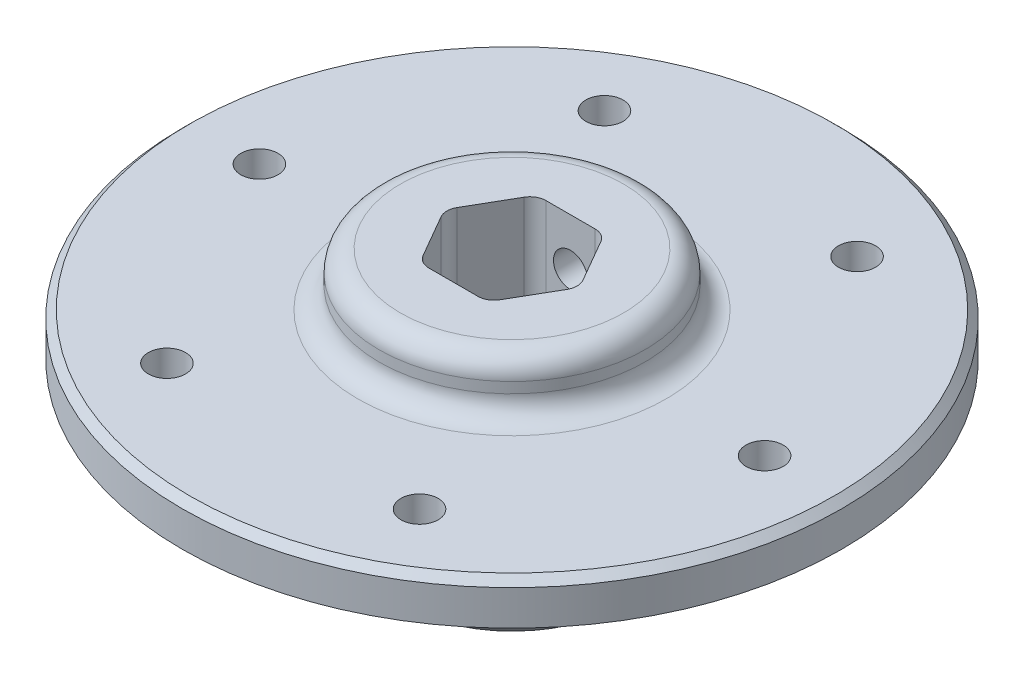
ISO-10303-21;
HEADER;
FILE_DESCRIPTION(('STEP AP214'),'2;1');
FILE_NAME('part.step','',(''),(''),'','','');
FILE_SCHEMA(('AUTOMOTIVE_DESIGN { 1 0 10303 214 1 1 1 1 }'));
ENDSEC;
DATA;
#1=APPLICATION_CONTEXT('core data for automotive mechanical design processes');
#2=APPLICATION_PROTOCOL_DEFINITION('international standard','automotive_design',2000,#1);
#3=PRODUCT_CONTEXT('',#1,'mechanical');
#4=PRODUCT('Part','Part','',(#3));
#5=PRODUCT_RELATED_PRODUCT_CATEGORY('part','',(#4));
#6=PRODUCT_DEFINITION_FORMATION('','',#4);
#7=PRODUCT_DEFINITION_CONTEXT('part definition',#1,'design');
#8=PRODUCT_DEFINITION('design','',#6,#7);
#9=PRODUCT_DEFINITION_SHAPE('','',#8);
#10=(LENGTH_UNIT() NAMED_UNIT(*) SI_UNIT(.MILLI.,.METRE.));
#11=(NAMED_UNIT(*) PLANE_ANGLE_UNIT() SI_UNIT($,.RADIAN.));
#12=(NAMED_UNIT(*) SI_UNIT($,.STERADIAN.) SOLID_ANGLE_UNIT());
#13=UNCERTAINTY_MEASURE_WITH_UNIT(LENGTH_MEASURE(1.E-05),#10,'distance_accuracy_value','');
#14=(GEOMETRIC_REPRESENTATION_CONTEXT(3) GLOBAL_UNCERTAINTY_ASSIGNED_CONTEXT((#13)) GLOBAL_UNIT_ASSIGNED_CONTEXT((#10,
#11,#12)) REPRESENTATION_CONTEXT('',''));
#15=CARTESIAN_POINT('',(0.,0.,0.));
#16=DIRECTION('',(0.,0.,1.));
#17=DIRECTION('',(1.,0.,0.));
#18=AXIS2_PLACEMENT_3D('',#15,#16,#17);
#19=CARTESIAN_POINT('',(0.,4.,0.));
#20=DIRECTION('',(0.,1.,0.));
#21=DIRECTION('',(0.,0.,1.));
#22=AXIS2_PLACEMENT_3D('',#19,#20,#21);
#23=PLANE('',#22);
#24=CARTESIAN_POINT('',(0.,4.,0.));
#25=DIRECTION('',(0.,1.,0.));
#26=DIRECTION('',(0.,0.,1.));
#27=AXIS2_PLACEMENT_3D('',#24,#25,#26);
#28=CIRCLE('',#27,30.3);
#29=CARTESIAN_POINT('',(0.,4.,30.3));
#30=VERTEX_POINT('',#29);
#31=EDGE_CURVE('E162',#30,#30,#28,.T.);
#32=ORIENTED_EDGE('',*,*,#31,.T.);
#33=EDGE_LOOP('',(#32));
#34=FACE_BOUND('',#33,.T.);
#35=CARTESIAN_POINT('',(0.,4.,0.));
#36=DIRECTION('',(0.,1.,0.));
#37=DIRECTION('',(0.,0.,1.));
#38=AXIS2_PLACEMENT_3D('',#35,#36,#37);
#39=CIRCLE('',#38,14.5);
#40=CARTESIAN_POINT('',(0.,4.,14.5));
#41=VERTEX_POINT('',#40);
#42=EDGE_CURVE('E266',#41,#41,#39,.F.);
#43=ORIENTED_EDGE('',*,*,#42,.T.);
#44=EDGE_LOOP('',(#43));
#45=FACE_BOUND('',#44,.T.);
#46=CARTESIAN_POINT('',(-11.8749999999977,4.,20.5681033398798));
#47=DIRECTION('',(0.,1.,0.));
#48=DIRECTION('',(0.,0.,1.));
#49=AXIS2_PLACEMENT_3D('',#46,#47,#48);
#50=CIRCLE('',#49,1.75);
#51=CARTESIAN_POINT('',(-11.8749999999977,4.,22.3181033398798));
#52=VERTEX_POINT('',#51);
#53=EDGE_CURVE('E388',#52,#52,#50,.T.);
#54=ORIENTED_EDGE('',*,*,#53,.F.);
#55=EDGE_LOOP('',(#54));
#56=FACE_BOUND('',#55,.T.);
#57=CARTESIAN_POINT('',(23.7500000000006,4.,-2.28723290307542E-12));
#58=DIRECTION('',(0.,1.,0.));
#59=DIRECTION('',(0.,0.,1.));
#60=AXIS2_PLACEMENT_3D('',#57,#58,#59);
#61=CIRCLE('',#60,1.75);
#62=CARTESIAN_POINT('',(23.7500000000006,4.,1.74999999999771));
#63=VERTEX_POINT('',#62);
#64=EDGE_CURVE('E392',#63,#63,#61,.T.);
#65=ORIENTED_EDGE('',*,*,#64,.F.);
#66=EDGE_LOOP('',(#65));
#67=FACE_BOUND('',#66,.T.);
#68=CARTESIAN_POINT('',(-11.875,4.,-20.5681033398804));
#69=DIRECTION('',(0.,1.,0.));
#70=DIRECTION('',(0.,0.,1.));
#71=AXIS2_PLACEMENT_3D('',#68,#69,#70);
#72=CIRCLE('',#71,1.75);
#73=CARTESIAN_POINT('',(-11.875,4.,-18.8181033398804));
#74=VERTEX_POINT('',#73);
#75=EDGE_CURVE('E256',#74,#74,#72,.T.);
#76=ORIENTED_EDGE('',*,*,#75,.F.);
#77=EDGE_LOOP('',(#76));
#78=FACE_BOUND('',#77,.T.);
#79=CARTESIAN_POINT('',(11.8749999999996,4.,-20.5681033398817));
#80=DIRECTION('',(0.,1.,0.));
#81=DIRECTION('',(0.,0.,1.));
#82=AXIS2_PLACEMENT_3D('',#79,#80,#81);
#83=CIRCLE('',#82,1.75);
#84=CARTESIAN_POINT('',(11.8749999999996,4.,-18.8181033398817));
#85=VERTEX_POINT('',#84);
#86=EDGE_CURVE('E398',#85,#85,#83,.T.);
#87=ORIENTED_EDGE('',*,*,#86,.F.);
#88=EDGE_LOOP('',(#87));
#89=FACE_BOUND('',#88,.T.);
#90=CARTESIAN_POINT('',(11.8750000000019,4.,20.5681033398785));
#91=DIRECTION('',(0.,1.,0.));
#92=DIRECTION('',(0.,0.,1.));
#93=AXIS2_PLACEMENT_3D('',#90,#91,#92);
#94=CIRCLE('',#93,1.75);
#95=CARTESIAN_POINT('',(11.8750000000019,4.,22.3181033398785));
#96=VERTEX_POINT('',#95);
#97=EDGE_CURVE('E402',#96,#96,#94,.T.);
#98=ORIENTED_EDGE('',*,*,#97,.F.);
#99=EDGE_LOOP('',(#98));
#100=FACE_BOUND('',#99,.T.);
#101=CARTESIAN_POINT('',(-23.7499999999987,4.,4.01588484688631E-13));
#102=DIRECTION('',(0.,1.,0.));
#103=DIRECTION('',(0.,0.,1.));
#104=AXIS2_PLACEMENT_3D('',#101,#102,#103);
#105=CIRCLE('',#104,1.75);
#106=CARTESIAN_POINT('',(-23.7499999999987,4.,1.7500000000004));
#107=VERTEX_POINT('',#106);
#108=EDGE_CURVE('E405',#107,#107,#105,.T.);
#109=ORIENTED_EDGE('',*,*,#108,.F.);
#110=EDGE_LOOP('',(#109));
#111=FACE_BOUND('',#110,.T.);
#112=ADVANCED_FACE('F32',(#34,#45,#56,#67,#78,#89,#100,#111),#23,.T.);
#113=CARTESIAN_POINT('',(0.,0.,0.));
#114=DIRECTION('',(0.,1.,0.));
#115=DIRECTION('',(0.,0.,1.));
#116=AXIS2_PLACEMENT_3D('',#113,#114,#115);
#117=PLANE('',#116);
#118=CARTESIAN_POINT('',(0.,0.,0.));
#119=DIRECTION('',(0.,1.,0.));
#120=DIRECTION('',(0.,0.,1.));
#121=AXIS2_PLACEMENT_3D('',#118,#119,#120);
#122=CIRCLE('',#121,11.5);
#123=CARTESIAN_POINT('',(0.,0.,11.5));
#124=VERTEX_POINT('',#123);
#125=EDGE_CURVE('E376',#124,#124,#122,.F.);
#126=ORIENTED_EDGE('',*,*,#125,.F.);
#127=EDGE_LOOP('',(#126));
#128=FACE_BOUND('',#127,.T.);
#129=CARTESIAN_POINT('',(0.,0.,0.));
#130=DIRECTION('',(0.,1.,0.));
#131=DIRECTION('',(0.,0.,1.));
#132=AXIS2_PLACEMENT_3D('',#129,#130,#131);
#133=CIRCLE('',#132,31.);
#134=CARTESIAN_POINT('',(0.,0.,31.));
#135=VERTEX_POINT('',#134);
#136=EDGE_CURVE('E253',#135,#135,#133,.T.);
#137=ORIENTED_EDGE('',*,*,#136,.F.);
#138=EDGE_LOOP('',(#137));
#139=FACE_BOUND('',#138,.T.);
#140=CARTESIAN_POINT('',(-11.875,0.,-20.5681033398804));
#141=DIRECTION('',(0.,1.,0.));
#142=DIRECTION('',(0.,0.,1.));
#143=AXIS2_PLACEMENT_3D('',#140,#141,#142);
#144=CIRCLE('',#143,1.75);
#145=CARTESIAN_POINT('',(-11.875,0.,-18.8181033398804));
#146=VERTEX_POINT('',#145);
#147=EDGE_CURVE('E261',#146,#146,#144,.T.);
#148=ORIENTED_EDGE('',*,*,#147,.T.);
#149=EDGE_LOOP('',(#148));
#150=FACE_BOUND('',#149,.T.);
#151=CARTESIAN_POINT('',(11.8749999999996,0.,-20.5681033398817));
#152=DIRECTION('',(0.,1.,0.));
#153=DIRECTION('',(0.,0.,1.));
#154=AXIS2_PLACEMENT_3D('',#151,#152,#153);
#155=CIRCLE('',#154,1.75);
#156=CARTESIAN_POINT('',(11.8749999999996,0.,-18.8181033398817));
#157=VERTEX_POINT('',#156);
#158=EDGE_CURVE('E424',#157,#157,#155,.T.);
#159=ORIENTED_EDGE('',*,*,#158,.T.);
#160=EDGE_LOOP('',(#159));
#161=FACE_BOUND('',#160,.T.);
#162=CARTESIAN_POINT('',(23.7500000000006,0.,-2.28723290307542E-12));
#163=DIRECTION('',(0.,1.,0.));
#164=DIRECTION('',(0.,0.,1.));
#165=AXIS2_PLACEMENT_3D('',#162,#163,#164);
#166=CIRCLE('',#165,1.75);
#167=CARTESIAN_POINT('',(23.7500000000006,0.,1.74999999999771));
#168=VERTEX_POINT('',#167);
#169=EDGE_CURVE('E420',#168,#168,#166,.T.);
#170=ORIENTED_EDGE('',*,*,#169,.T.);
#171=EDGE_LOOP('',(#170));
#172=FACE_BOUND('',#171,.T.);
#173=CARTESIAN_POINT('',(11.8750000000019,0.,20.5681033398785));
#174=DIRECTION('',(0.,1.,0.));
#175=DIRECTION('',(0.,0.,1.));
#176=AXIS2_PLACEMENT_3D('',#173,#174,#175);
#177=CIRCLE('',#176,1.75);
#178=CARTESIAN_POINT('',(11.8750000000019,0.,22.3181033398785));
#179=VERTEX_POINT('',#178);
#180=EDGE_CURVE('E417',#179,#179,#177,.T.);
#181=ORIENTED_EDGE('',*,*,#180,.T.);
#182=EDGE_LOOP('',(#181));
#183=FACE_BOUND('',#182,.T.);
#184=CARTESIAN_POINT('',(-11.8749999999977,0.,20.5681033398798));
#185=DIRECTION('',(0.,1.,0.));
#186=DIRECTION('',(0.,0.,1.));
#187=AXIS2_PLACEMENT_3D('',#184,#185,#186);
#188=CIRCLE('',#187,1.75);
#189=CARTESIAN_POINT('',(-11.8749999999977,0.,22.3181033398798));
#190=VERTEX_POINT('',#189);
#191=EDGE_CURVE('E406',#190,#190,#188,.T.);
#192=ORIENTED_EDGE('',*,*,#191,.T.);
#193=EDGE_LOOP('',(#192));
#194=FACE_BOUND('',#193,.T.);
#195=CARTESIAN_POINT('',(-23.7499999999987,0.,4.01588484688631E-13));
#196=DIRECTION('',(0.,1.,0.));
#197=DIRECTION('',(0.,0.,1.));
#198=AXIS2_PLACEMENT_3D('',#195,#196,#197);
#199=CIRCLE('',#198,1.75);
#200=CARTESIAN_POINT('',(-23.7499999999987,0.,1.7500000000004));
#201=VERTEX_POINT('',#200);
#202=EDGE_CURVE('E407',#201,#201,#199,.T.);
#203=ORIENTED_EDGE('',*,*,#202,.T.);
#204=EDGE_LOOP('',(#203));
#205=FACE_BOUND('',#204,.T.);
#206=ADVANCED_FACE('F239',(#128,#139,#150,#161,#172,#183,#194,#205),#117,.F.);
#207=CARTESIAN_POINT('',(0.,4.,0.));
#208=DIRECTION('',(0.,-1.,0.));
#209=DIRECTION('',(0.,0.,-1.));
#210=AXIS2_PLACEMENT_3D('',#207,#208,#209);
#211=CYLINDRICAL_SURFACE('',#210,31.);
#212=CARTESIAN_POINT('',(0.,3.30000000000001,0.));
#213=DIRECTION('',(0.,1.,0.));
#214=DIRECTION('',(0.,0.,1.));
#215=AXIS2_PLACEMENT_3D('',#212,#213,#214);
#216=CIRCLE('',#215,31.);
#217=CARTESIAN_POINT('',(0.,3.30000000000001,31.));
#218=VERTEX_POINT('',#217);
#219=EDGE_CURVE('E250',#218,#218,#216,.F.);
#220=ORIENTED_EDGE('',*,*,#219,.T.);
#221=EDGE_LOOP('',(#220));
#222=FACE_BOUND('',#221,.T.);
#223=ORIENTED_EDGE('',*,*,#136,.T.);
#224=EDGE_LOOP('',(#223));
#225=FACE_BOUND('',#224,.T.);
#226=ADVANCED_FACE('F235',(#222,#225),#211,.T.);
#227=CARTESIAN_POINT('',(-11.875,4.,-20.5681033398804));
#228=DIRECTION('',(0.,-1.,0.));
#229=DIRECTION('',(0.,0.,-1.));
#230=AXIS2_PLACEMENT_3D('',#227,#228,#229);
#231=CYLINDRICAL_SURFACE('',#230,1.75);
#232=ORIENTED_EDGE('',*,*,#75,.T.);
#233=EDGE_LOOP('',(#232));
#234=FACE_BOUND('',#233,.T.);
#235=ORIENTED_EDGE('',*,*,#147,.F.);
#236=EDGE_LOOP('',(#235));
#237=FACE_BOUND('',#236,.T.);
#238=ADVANCED_FACE('F231',(#234,#237),#231,.F.);
#239=CARTESIAN_POINT('',(11.8749999999996,4.,-20.5681033398817));
#240=DIRECTION('',(0.,-1.,0.));
#241=DIRECTION('',(0.,0.,-1.));
#242=AXIS2_PLACEMENT_3D('',#239,#240,#241);
#243=CYLINDRICAL_SURFACE('',#242,1.75);
#244=ORIENTED_EDGE('',*,*,#86,.T.);
#245=EDGE_LOOP('',(#244));
#246=FACE_BOUND('',#245,.T.);
#247=ORIENTED_EDGE('',*,*,#158,.F.);
#248=EDGE_LOOP('',(#247));
#249=FACE_BOUND('',#248,.T.);
#250=ADVANCED_FACE('F227',(#246,#249),#243,.F.);
#251=CARTESIAN_POINT('',(23.7500000000006,4.,-2.28723290307542E-12));
#252=DIRECTION('',(0.,-1.,0.));
#253=DIRECTION('',(0.,0.,-1.));
#254=AXIS2_PLACEMENT_3D('',#251,#252,#253);
#255=CYLINDRICAL_SURFACE('',#254,1.75);
#256=ORIENTED_EDGE('',*,*,#64,.T.);
#257=EDGE_LOOP('',(#256));
#258=FACE_BOUND('',#257,.T.);
#259=ORIENTED_EDGE('',*,*,#169,.F.);
#260=EDGE_LOOP('',(#259));
#261=FACE_BOUND('',#260,.T.);
#262=ADVANCED_FACE('F223',(#258,#261),#255,.F.);
#263=CARTESIAN_POINT('',(11.8750000000019,4.,20.5681033398785));
#264=DIRECTION('',(0.,-1.,0.));
#265=DIRECTION('',(0.,0.,-1.));
#266=AXIS2_PLACEMENT_3D('',#263,#264,#265);
#267=CYLINDRICAL_SURFACE('',#266,1.75);
#268=ORIENTED_EDGE('',*,*,#97,.T.);
#269=EDGE_LOOP('',(#268));
#270=FACE_BOUND('',#269,.T.);
#271=ORIENTED_EDGE('',*,*,#180,.F.);
#272=EDGE_LOOP('',(#271));
#273=FACE_BOUND('',#272,.T.);
#274=ADVANCED_FACE('F219',(#270,#273),#267,.F.);
#275=CARTESIAN_POINT('',(-11.8749999999977,4.,20.5681033398798));
#276=DIRECTION('',(0.,-1.,0.));
#277=DIRECTION('',(0.,0.,-1.));
#278=AXIS2_PLACEMENT_3D('',#275,#276,#277);
#279=CYLINDRICAL_SURFACE('',#278,1.75);
#280=ORIENTED_EDGE('',*,*,#53,.T.);
#281=EDGE_LOOP('',(#280));
#282=FACE_BOUND('',#281,.T.);
#283=ORIENTED_EDGE('',*,*,#191,.F.);
#284=EDGE_LOOP('',(#283));
#285=FACE_BOUND('',#284,.T.);
#286=ADVANCED_FACE('F215',(#282,#285),#279,.F.);
#287=CARTESIAN_POINT('',(-23.7499999999987,4.,4.01588484688631E-13));
#288=DIRECTION('',(0.,-1.,0.));
#289=DIRECTION('',(0.,0.,-1.));
#290=AXIS2_PLACEMENT_3D('',#287,#288,#289);
#291=CYLINDRICAL_SURFACE('',#290,1.75);
#292=ORIENTED_EDGE('',*,*,#108,.T.);
#293=EDGE_LOOP('',(#292));
#294=FACE_BOUND('',#293,.T.);
#295=ORIENTED_EDGE('',*,*,#202,.F.);
#296=EDGE_LOOP('',(#295));
#297=FACE_BOUND('',#296,.T.);
#298=ADVANCED_FACE('F210',(#294,#297),#291,.F.);
#299=CARTESIAN_POINT('',(0.,9.,0.));
#300=DIRECTION('',(0.,-1.,0.));
#301=DIRECTION('',(0.,0.,-1.));
#302=AXIS2_PLACEMENT_3D('',#299,#300,#301);
#303=CYLINDRICAL_SURFACE('',#302,12.5);
#304=CARTESIAN_POINT('',(0.,6.,0.));
#305=DIRECTION('',(0.,1.,0.));
#306=DIRECTION('',(0.,0.,1.));
#307=AXIS2_PLACEMENT_3D('',#304,#305,#306);
#308=CIRCLE('',#307,12.5);
#309=CARTESIAN_POINT('',(-0.556776436283003,6.,-12.4875938434912));
#310=VERTEX_POINT('',#309);
#311=CARTESIAN_POINT('',(0.556776436283003,6.,-12.4875938434912));
#312=VERTEX_POINT('',#311);
#313=EDGE_CURVE('E160',#310,#312,#308,.T.);
#314=ORIENTED_EDGE('',*,*,#313,.T.);
#315=CARTESIAN_POINT('',(0.556776436283003,6.,-12.4875938434912));
#316=CARTESIAN_POINT('',(0.514944833006139,6.01552656270061,-12.4894598934136));
#317=CARTESIAN_POINT('',(0.472476516686557,6.02929840490636,-12.4911415204886));
#318=CARTESIAN_POINT('',(0.386524922577014,6.05325192354075,-12.4940964517157));
#319=CARTESIAN_POINT('',(0.343041632451398,6.06343355631092,-12.4953697509023));
#320=CARTESIAN_POINT('',(0.211395886942789,6.08848347239111,-12.4985193767744));
#321=CARTESIAN_POINT('',(0.122098071384988,6.09783435174234,-12.4997226519266));
#322=CARTESIAN_POINT('',(-0.0568152590212876,6.10149967022687,-12.5001921117547));
#323=CARTESIAN_POINT('',(-0.146430958032228,6.09580314152516,-12.4994568834847));
#324=CARTESIAN_POINT('',(-0.323225489425103,6.06954407571279,-12.496131188003));
#325=CARTESIAN_POINT('',(-0.410410674635706,6.04902500586424,-12.4935461455993));
#326=CARTESIAN_POINT('',(-0.515842489830032,6.01472315716607,-12.4893694790613));
#327=CARTESIAN_POINT('',(-0.53639248117208,6.00756922481068,-12.4885035668325));
#328=CARTESIAN_POINT('',(-0.556776436283003,6.,-12.4875938434912));
#329=B_SPLINE_CURVE_WITH_KNOTS('',3,(#315,#316,#317,#318,#319,#320,#321,#322,#323,#324,#325,
#326,#327,#328),.UNSPECIFIED.,.F.,.F.,(4,2,2,2,2,2,4),(0.,0.133895207814031,0.267792043794184,
0.535777046270788,0.803957432973976,1.07135455391247,1.13666446979724),.UNSPECIFIED.);
#330=EDGE_CURVE('E155',#312,#310,#329,.T.);
#331=ORIENTED_EDGE('',*,*,#330,.T.);
#332=EDGE_LOOP('',(#314,#331));
#333=FACE_BOUND('',#332,.T.);
#334=CARTESIAN_POINT('',(0.,7.,0.));
#335=DIRECTION('',(0.,1.,0.));
#336=DIRECTION('',(0.,0.,1.));
#337=AXIS2_PLACEMENT_3D('',#334,#335,#336);
#338=CIRCLE('',#337,12.5);
#339=CARTESIAN_POINT('',(0.,7.,12.5));
#340=VERTEX_POINT('',#339);
#341=EDGE_CURVE('E255',#340,#340,#338,.F.);
#342=ORIENTED_EDGE('',*,*,#341,.T.);
#343=EDGE_LOOP('',(#342));
#344=FACE_BOUND('',#343,.T.);
#345=ADVANCED_FACE('F204',(#333,#344),#303,.T.);
#346=CARTESIAN_POINT('',(0.,9.,0.));
#347=DIRECTION('',(0.,1.,0.));
#348=DIRECTION('',(0.,0.,1.));
#349=AXIS2_PLACEMENT_3D('',#346,#347,#348);
#350=PLANE('',#349);
#351=DIRECTION('',(-0.5,0.,-0.866025403784438));
#352=VECTOR('',#351,1.);
#353=CARTESIAN_POINT('',(6.35085296108588,9.,0.));
#354=LINE('',#353,#352);
#355=CARTESIAN_POINT('',(5.91784025919367,9.,-0.749999999999999));
#356=VERTEX_POINT('',#355);
#357=CARTESIAN_POINT('',(3.60843918243516,9.,-4.75));
#358=VERTEX_POINT('',#357);
#359=EDGE_CURVE('E459',#356,#358,#354,.T.);
#360=ORIENTED_EDGE('',*,*,#359,.F.);
#361=CARTESIAN_POINT('',(4.61880215351701,9.,0.));
#362=DIRECTION('',(0.,1.,0.));
#363=DIRECTION('',(0.,0.,1.));
#364=AXIS2_PLACEMENT_3D('',#361,#362,#363);
#365=CIRCLE('',#364,1.5);
#366=CARTESIAN_POINT('',(5.91784025919367,9.,0.75));
#367=VERTEX_POINT('',#366);
#368=EDGE_CURVE('E318',#356,#367,#365,.F.);
#369=ORIENTED_EDGE('',*,*,#368,.T.);
#370=DIRECTION('',(0.5,0.,-0.866025403784439));
#371=VECTOR('',#370,1.);
#372=CARTESIAN_POINT('',(3.17542648054294,9.,5.5));
#373=LINE('',#372,#371);
#374=CARTESIAN_POINT('',(3.60843918243516,9.,4.75));
#375=VERTEX_POINT('',#374);
#376=EDGE_CURVE('E412',#375,#367,#373,.T.);
#377=ORIENTED_EDGE('',*,*,#376,.F.);
#378=CARTESIAN_POINT('',(2.3094010767585,9.,4.));
#379=DIRECTION('',(0.,1.,0.));
#380=DIRECTION('',(0.,0.,1.));
#381=AXIS2_PLACEMENT_3D('',#378,#379,#380);
#382=CIRCLE('',#381,1.5);
#383=CARTESIAN_POINT('',(2.3094010767585,9.,5.5));
#384=VERTEX_POINT('',#383);
#385=EDGE_CURVE('E326',#375,#384,#382,.F.);
#386=ORIENTED_EDGE('',*,*,#385,.T.);
#387=DIRECTION('',(1.,0.,0.));
#388=VECTOR('',#387,1.);
#389=CARTESIAN_POINT('',(-3.17542648054294,9.,5.5));
#390=LINE('',#389,#388);
#391=CARTESIAN_POINT('',(-2.3094010767585,9.,5.5));
#392=VERTEX_POINT('',#391);
#393=EDGE_CURVE('E448',#392,#384,#390,.T.);
#394=ORIENTED_EDGE('',*,*,#393,.F.);
#395=CARTESIAN_POINT('',(-2.3094010767585,9.,4.));
#396=DIRECTION('',(0.,1.,0.));
#397=DIRECTION('',(0.,0.,1.));
#398=AXIS2_PLACEMENT_3D('',#395,#396,#397);
#399=CIRCLE('',#398,1.5);
#400=CARTESIAN_POINT('',(-3.60843918243516,9.,4.75));
#401=VERTEX_POINT('',#400);
#402=EDGE_CURVE('E331',#392,#401,#399,.F.);
#403=ORIENTED_EDGE('',*,*,#402,.T.);
#404=DIRECTION('',(0.5,0.,0.866025403784439));
#405=VECTOR('',#404,1.);
#406=CARTESIAN_POINT('',(-6.35085296108588,9.,0.));
#407=LINE('',#406,#405);
#408=CARTESIAN_POINT('',(-5.91784025919366,9.,0.75));
#409=VERTEX_POINT('',#408);
#410=EDGE_CURVE('E451',#409,#401,#407,.T.);
#411=ORIENTED_EDGE('',*,*,#410,.F.);
#412=CARTESIAN_POINT('',(-4.618802153517,9.,0.));
#413=DIRECTION('',(0.,1.,0.));
#414=DIRECTION('',(0.,0.,1.));
#415=AXIS2_PLACEMENT_3D('',#412,#413,#414);
#416=CIRCLE('',#415,1.5);
#417=CARTESIAN_POINT('',(-5.91784025919366,9.,-0.749999999999999));
#418=VERTEX_POINT('',#417);
#419=EDGE_CURVE('E335',#409,#418,#416,.F.);
#420=ORIENTED_EDGE('',*,*,#419,.T.);
#421=DIRECTION('',(-0.5,0.,0.866025403784439));
#422=VECTOR('',#421,1.);
#423=CARTESIAN_POINT('',(-3.17542648054294,9.,-5.5));
#424=LINE('',#423,#422);
#425=CARTESIAN_POINT('',(-3.60843918243516,9.,-4.75));
#426=VERTEX_POINT('',#425);
#427=EDGE_CURVE('E454',#426,#418,#424,.T.);
#428=ORIENTED_EDGE('',*,*,#427,.F.);
#429=CARTESIAN_POINT('',(-2.3094010767585,9.,-4.));
#430=DIRECTION('',(0.,1.,0.));
#431=DIRECTION('',(0.,0.,1.));
#432=AXIS2_PLACEMENT_3D('',#429,#430,#431);
#433=CIRCLE('',#432,1.5);
#434=CARTESIAN_POINT('',(-2.3094010767585,9.,-5.5));
#435=VERTEX_POINT('',#434);
#436=EDGE_CURVE('E11',#426,#435,#433,.F.);
#437=ORIENTED_EDGE('',*,*,#436,.T.);
#438=DIRECTION('',(-1.,0.,0.));
#439=VECTOR('',#438,1.);
#440=CARTESIAN_POINT('',(3.17542648054294,9.,-5.5));
#441=LINE('',#440,#439);
#442=CARTESIAN_POINT('',(2.3094010767585,9.,-5.5));
#443=VERTEX_POINT('',#442);
#444=EDGE_CURVE('E457',#443,#435,#441,.T.);
#445=ORIENTED_EDGE('',*,*,#444,.F.);
#446=CARTESIAN_POINT('',(2.3094010767585,9.,-4.));
#447=DIRECTION('',(0.,1.,0.));
#448=DIRECTION('',(0.,0.,1.));
#449=AXIS2_PLACEMENT_3D('',#446,#447,#448);
#450=CIRCLE('',#449,1.5);
#451=EDGE_CURVE('E339',#443,#358,#450,.F.);
#452=ORIENTED_EDGE('',*,*,#451,.T.);
#453=EDGE_LOOP('',(#360,#369,#377,#386,#394,#403,#411,#420,#428,#437,#445,#452));
#454=FACE_BOUND('',#453,.T.);
#455=CARTESIAN_POINT('',(0.,9.,0.));
#456=DIRECTION('',(0.,1.,0.));
#457=DIRECTION('',(0.,0.,1.));
#458=AXIS2_PLACEMENT_3D('',#455,#456,#457);
#459=CIRCLE('',#458,10.5);
#460=CARTESIAN_POINT('',(0.,9.,10.5));
#461=VERTEX_POINT('',#460);
#462=EDGE_CURVE('E145',#461,#461,#459,.T.);
#463=ORIENTED_EDGE('',*,*,#462,.T.);
#464=EDGE_LOOP('',(#463));
#465=FACE_BOUND('',#464,.T.);
#466=ADVANCED_FACE('F209',(#454,#465),#350,.T.);
#467=CARTESIAN_POINT('',(6.35085296108588,0.,0.));
#468=DIRECTION('',(0.866025403784439,0.,-0.5));
#469=DIRECTION('',(-0.5,0.,-0.866025403784439));
#470=AXIS2_PLACEMENT_3D('',#467,#468,#469);
#471=PLANE('',#470);
#472=ORIENTED_EDGE('',*,*,#359,.T.);
#473=DIRECTION('',(0.,-1.,0.));
#474=VECTOR('',#473,1.);
#475=CARTESIAN_POINT('',(3.60843918243516,-15.,-4.75));
#476=LINE('',#475,#474);
#477=CARTESIAN_POINT('',(3.60843918243515,-15.,-4.74999999999999));
#478=VERTEX_POINT('',#477);
#479=EDGE_CURVE('E366',#358,#478,#476,.T.);
#480=ORIENTED_EDGE('',*,*,#479,.T.);
#481=DIRECTION('',(0.500000000000006,0.,0.866025403784435));
#482=VECTOR('',#481,1.);
#483=CARTESIAN_POINT('',(3.17542648054291,-15.,-5.50000000000002));
#484=LINE('',#483,#482);
#485=CARTESIAN_POINT('',(5.91784025919368,-15.,-0.750000000000008));
#486=VERTEX_POINT('',#485);
#487=EDGE_CURVE('E156',#478,#486,#484,.T.);
#488=ORIENTED_EDGE('',*,*,#487,.T.);
#489=DIRECTION('',(0.,-1.,0.));
#490=VECTOR('',#489,1.);
#491=CARTESIAN_POINT('',(5.91784025919367,9.,-0.75));
#492=LINE('',#491,#490);
#493=EDGE_CURVE('E319',#486,#356,#492,.F.);
#494=ORIENTED_EDGE('',*,*,#493,.T.);
#495=EDGE_LOOP('',(#472,#480,#488,#494));
#496=FACE_BOUND('',#495,.T.);
#497=ADVANCED_FACE('F478',(#496),#471,.F.);
#498=CARTESIAN_POINT('',(3.17542648054294,0.,5.5));
#499=DIRECTION('',(0.866025403784439,0.,0.5));
#500=DIRECTION('',(0.5,0.,-0.866025403784439));
#501=AXIS2_PLACEMENT_3D('',#498,#499,#500);
#502=PLANE('',#501);
#503=DIRECTION('',(-0.499999999999994,0.,0.866025403784442));
#504=VECTOR('',#503,1.);
#505=CARTESIAN_POINT('',(6.35085296108588,-15.,0.));
#506=LINE('',#505,#504);
#507=CARTESIAN_POINT('',(5.91784025919365,-15.,0.749999999999991));
#508=VERTEX_POINT('',#507);
#509=CARTESIAN_POINT('',(3.60843918243517,-15.,4.75000000000001));
#510=VERTEX_POINT('',#509);
#511=EDGE_CURVE('E507',#508,#510,#506,.T.);
#512=ORIENTED_EDGE('',*,*,#511,.T.);
#513=DIRECTION('',(0.,-1.,0.));
#514=VECTOR('',#513,1.);
#515=CARTESIAN_POINT('',(3.60843918243516,9.,4.75));
#516=LINE('',#515,#514);
#517=EDGE_CURVE('E343',#510,#375,#516,.F.);
#518=ORIENTED_EDGE('',*,*,#517,.T.);
#519=ORIENTED_EDGE('',*,*,#376,.T.);
#520=DIRECTION('',(0.,-1.,0.));
#521=VECTOR('',#520,1.);
#522=CARTESIAN_POINT('',(5.91784025919367,-15.,0.749999999999999));
#523=LINE('',#522,#521);
#524=EDGE_CURVE('E320',#367,#508,#523,.T.);
#525=ORIENTED_EDGE('',*,*,#524,.T.);
#526=EDGE_LOOP('',(#512,#518,#519,#525));
#527=FACE_BOUND('',#526,.T.);
#528=ADVANCED_FACE('F190',(#527),#502,.F.);
#529=CARTESIAN_POINT('',(-3.17542648054294,0.,5.5));
#530=DIRECTION('',(0.,0.,1.));
#531=DIRECTION('',(1.,0.,0.));
#532=AXIS2_PLACEMENT_3D('',#529,#530,#531);
#533=PLANE('',#532);
#534=DIRECTION('',(-1.,0.,0.));
#535=VECTOR('',#534,1.);
#536=CARTESIAN_POINT('',(3.17542648054298,-15.,5.49999999999998));
#537=LINE('',#536,#535);
#538=CARTESIAN_POINT('',(2.3094010767585,-15.,5.49999999999998));
#539=VERTEX_POINT('',#538);
#540=CARTESIAN_POINT('',(-2.3094010767585,-15.,5.50000000000002));
#541=VERTEX_POINT('',#540);
#542=EDGE_CURVE('E504',#539,#541,#537,.T.);
#543=ORIENTED_EDGE('',*,*,#542,.T.);
#544=DIRECTION('',(0.,-1.,0.));
#545=VECTOR('',#544,1.);
#546=CARTESIAN_POINT('',(-2.3094010767585,9.,5.5));
#547=LINE('',#546,#545);
#548=EDGE_CURVE('E346',#541,#392,#547,.F.);
#549=ORIENTED_EDGE('',*,*,#548,.T.);
#550=ORIENTED_EDGE('',*,*,#393,.T.);
#551=DIRECTION('',(0.,-1.,0.));
#552=VECTOR('',#551,1.);
#553=CARTESIAN_POINT('',(2.3094010767585,-15.,5.5));
#554=LINE('',#553,#552);
#555=EDGE_CURVE('E348',#384,#539,#554,.T.);
#556=ORIENTED_EDGE('',*,*,#555,.T.);
#557=EDGE_LOOP('',(#543,#549,#550,#556));
#558=FACE_BOUND('',#557,.T.);
#559=ADVANCED_FACE('F484',(#558),#533,.F.);
#560=CARTESIAN_POINT('',(-6.35085296108588,0.,0.));
#561=DIRECTION('',(-0.866025403784439,0.,0.5));
#562=DIRECTION('',(0.5,0.,0.866025403784439));
#563=AXIS2_PLACEMENT_3D('',#560,#561,#562);
#564=PLANE('',#563);
#565=DIRECTION('',(-0.500000000000006,0.,-0.866025403784435));
#566=VECTOR('',#565,1.);
#567=CARTESIAN_POINT('',(-3.1754264805429,-15.,5.50000000000002));
#568=LINE('',#567,#566);
#569=CARTESIAN_POINT('',(-3.60843918243514,-15.,4.74999999999999));
#570=VERTEX_POINT('',#569);
#571=CARTESIAN_POINT('',(-5.91784025919367,-15.,0.750000000000008));
#572=VERTEX_POINT('',#571);
#573=EDGE_CURVE('E501',#570,#572,#568,.T.);
#574=ORIENTED_EDGE('',*,*,#573,.T.);
#575=DIRECTION('',(0.,-1.,0.));
#576=VECTOR('',#575,1.);
#577=CARTESIAN_POINT('',(-5.91784025919366,9.,0.75));
#578=LINE('',#577,#576);
#579=EDGE_CURVE('E351',#572,#409,#578,.F.);
#580=ORIENTED_EDGE('',*,*,#579,.T.);
#581=ORIENTED_EDGE('',*,*,#410,.T.);
#582=DIRECTION('',(0.,-1.,0.));
#583=VECTOR('',#582,1.);
#584=CARTESIAN_POINT('',(-3.60843918243516,-15.,4.75));
#585=LINE('',#584,#583);
#586=EDGE_CURVE('E353',#401,#570,#585,.T.);
#587=ORIENTED_EDGE('',*,*,#586,.T.);
#588=EDGE_LOOP('',(#574,#580,#581,#587));
#589=FACE_BOUND('',#588,.T.);
#590=ADVANCED_FACE('F473',(#589),#564,.F.);
#591=CARTESIAN_POINT('',(-3.17542648054294,0.,-5.5));
#592=DIRECTION('',(-0.866025403784439,0.,-0.5));
#593=DIRECTION('',(-0.5,0.,0.866025403784439));
#594=AXIS2_PLACEMENT_3D('',#591,#592,#593);
#595=PLANE('',#594);
#596=ORIENTED_EDGE('',*,*,#427,.T.);
#597=DIRECTION('',(0.,-1.,0.));
#598=VECTOR('',#597,1.);
#599=CARTESIAN_POINT('',(-5.91784025919366,-15.,-0.749999999999999));
#600=LINE('',#599,#598);
#601=CARTESIAN_POINT('',(-5.91784025919365,-15.,-0.749999999999992));
#602=VERTEX_POINT('',#601);
#603=EDGE_CURVE('E356',#418,#602,#600,.T.);
#604=ORIENTED_EDGE('',*,*,#603,.T.);
#605=DIRECTION('',(0.499999999999994,0.,-0.866025403784442));
#606=VECTOR('',#605,1.);
#607=CARTESIAN_POINT('',(-6.35085296108588,-15.,0.));
#608=LINE('',#607,#606);
#609=CARTESIAN_POINT('',(-3.60843918243517,-15.,-4.75000000000001));
#610=VERTEX_POINT('',#609);
#611=EDGE_CURVE('E496',#602,#610,#608,.T.);
#612=ORIENTED_EDGE('',*,*,#611,.T.);
#613=DIRECTION('',(0.,-1.,0.));
#614=VECTOR('',#613,1.);
#615=CARTESIAN_POINT('',(-3.60843918243516,9.,-4.75));
#616=LINE('',#615,#614);
#617=EDGE_CURVE('E359',#610,#426,#616,.F.);
#618=ORIENTED_EDGE('',*,*,#617,.T.);
#619=EDGE_LOOP('',(#596,#604,#612,#618));
#620=FACE_BOUND('',#619,.T.);
#621=ADVANCED_FACE('F467',(#620),#595,.F.);
#622=CARTESIAN_POINT('',(3.17542648054294,0.,-5.5));
#623=DIRECTION('',(0.,0.,-1.));
#624=DIRECTION('',(-1.,0.,0.));
#625=AXIS2_PLACEMENT_3D('',#622,#623,#624);
#626=PLANE('',#625);
#627=DIRECTION('',(1.,0.,0.));
#628=VECTOR('',#627,1.);
#629=CARTESIAN_POINT('',(-3.17542648054298,-15.,-5.49999999999998));
#630=LINE('',#629,#628);
#631=CARTESIAN_POINT('',(-2.3094010767585,-15.,-5.49999999999998));
#632=VERTEX_POINT('',#631);
#633=CARTESIAN_POINT('',(2.3094010767585,-15.,-5.50000000000002));
#634=VERTEX_POINT('',#633);
#635=EDGE_CURVE('E495',#632,#634,#630,.T.);
#636=ORIENTED_EDGE('',*,*,#635,.T.);
#637=DIRECTION('',(0.,-1.,0.));
#638=VECTOR('',#637,1.);
#639=CARTESIAN_POINT('',(2.3094010767585,9.,-5.5));
#640=LINE('',#639,#638);
#641=EDGE_CURVE('E361',#634,#443,#640,.F.);
#642=ORIENTED_EDGE('',*,*,#641,.T.);
#643=ORIENTED_EDGE('',*,*,#444,.T.);
#644=DIRECTION('',(0.,-1.,0.));
#645=VECTOR('',#644,1.);
#646=CARTESIAN_POINT('',(-2.3094010767585,-15.,-5.5));
#647=LINE('',#646,#645);
#648=EDGE_CURVE('E363',#435,#632,#647,.T.);
#649=ORIENTED_EDGE('',*,*,#648,.T.);
#650=EDGE_LOOP('',(#636,#642,#643,#649));
#651=FACE_BOUND('',#650,.T.);
#652=CARTESIAN_POINT('',(0.,4.5,-5.5));
#653=DIRECTION('',(0.,0.,-1.));
#654=DIRECTION('',(-1.,0.,0.));
#655=AXIS2_PLACEMENT_3D('',#652,#653,#654);
#656=CIRCLE('',#655,1.6);
#657=CARTESIAN_POINT('',(-1.6,4.5,-5.5));
#658=VERTEX_POINT('',#657);
#659=EDGE_CURVE('E201',#658,#658,#656,.T.);
#660=ORIENTED_EDGE('',*,*,#659,.T.);
#661=EDGE_LOOP('',(#660));
#662=FACE_BOUND('',#661,.T.);
#663=ADVANCED_FACE('F282',(#651,#662),#626,.F.);
#664=CARTESIAN_POINT('',(0.,6.,0.));
#665=DIRECTION('',(0.,1.,0.));
#666=DIRECTION('',(0.,0.,1.));
#667=AXIS2_PLACEMENT_3D('',#664,#665,#666);
#668=TOROIDAL_SURFACE('',#667,14.5,2.);
#669=ORIENTED_EDGE('',*,*,#42,.F.);
#670=EDGE_LOOP('',(#669));
#671=FACE_BOUND('',#670,.T.);
#672=CARTESIAN_POINT('',(0.,6.,-12.5));
#673=CARTESIAN_POINT('',(0.00692045039959945,5.99723183051668,-12.5));
#674=CARTESIAN_POINT('',(0.0138409071268366,5.99446364765492,-12.5));
#675=CARTESIAN_POINT('',(0.639957782754507,5.74401782525832,-12.5));
#676=CARTESIAN_POINT('',(1.25926040794245,5.49638116106876,-12.5));
#677=CARTESIAN_POINT('',(2.19598118324079,5.14480512168622,-12.5));
#678=CARTESIAN_POINT('',(2.50959227709402,5.0309012655463,-12.5));
#679=CARTESIAN_POINT('',(2.98280021587472,4.8678414923304,-12.5));
#680=CARTESIAN_POINT('',(3.14104609888708,4.81477380746899,-12.5));
#681=CARTESIAN_POINT('',(3.45857632399663,4.71177253845097,-12.5));
#682=CARTESIAN_POINT('',(3.61786080336079,4.66183937823556,-12.5));
#683=CARTESIAN_POINT('',(3.77771148313055,4.61374192769849,-12.5));
#684=B_SPLINE_CURVE_WITH_KNOTS('',3,(#672,#673,#674,#675,#676,#677,#678,#679,#680,#681,#682,
#683),.UNSPECIFIED.,.F.,.F.,(4,2,2,2,2,4),(0.,0.0223606797750063,2.02304163827723,
3.02386365514292,3.5245550478984,4.02531401339034),.UNSPECIFIED.);
#685=CARTESIAN_POINT('',(0.,6.,-12.5));
#686=VERTEX_POINT('',#685);
#687=CARTESIAN_POINT('',(1.2432298196645,5.50716414525983,-12.5));
#688=VERTEX_POINT('',#687);
#689=EDGE_CURVE('E142',#686,#688,#684,.T.);
#690=ORIENTED_EDGE('',*,*,#689,.T.);
#691=CARTESIAN_POINT('',(1.2441532098477,5.50602325540997,-12.5002));
#692=CARTESIAN_POINT('',(1.21730784871671,5.53924033802677,-12.4943630729609));
#693=CARTESIAN_POINT('',(1.18902419029312,5.57148257294688,-12.4897519068252));
#694=CARTESIAN_POINT('',(1.12985794445986,5.63368990572983,-12.4825798793977));
#695=CARTESIAN_POINT('',(1.0989773754005,5.66365673821366,-12.4800174417915));
#696=CARTESIAN_POINT('',(1.03558051791897,5.72038676466758,-12.4765734396702));
#697=CARTESIAN_POINT('',(1.00311726016341,5.74720723196995,-12.4756550462301));
#698=CARTESIAN_POINT('',(0.936176988433487,5.7982078259965,-12.4750073389061));
#699=CARTESIAN_POINT('',(0.90170005928242,5.82238806381398,-12.4752779749713));
#700=CARTESIAN_POINT('',(0.818019753292657,5.87627794896826,-12.4768905843143));
#701=CARTESIAN_POINT('',(0.768039811867912,5.90477815383888,-12.4785879912157));
#702=CARTESIAN_POINT('',(0.664515766116207,5.95665256342798,-12.4827388949585));
#703=CARTESIAN_POINT('',(0.610927617813796,5.97993803145693,-12.485203987785));
#704=CARTESIAN_POINT('',(0.556237323451313,6.00019999999991,-12.4876178789231));
#705=B_SPLINE_CURVE_WITH_KNOTS('',3,(#691,#692,#693,#694,#695,#696,#697,#698,#699,#700,#701,
#702,#703,#704),.UNSPECIFIED.,.F.,.F.,(4,2,2,2,2,2,4),(0.,0.129235432284187,0.258371333449263,
0.384576385803221,0.510776125761359,0.683103923974775,0.858172538345679),.UNSPECIFIED.);
#706=EDGE_CURVE('E154',#688,#312,#705,.T.);
#707=ORIENTED_EDGE('',*,*,#706,.T.);
#708=ORIENTED_EDGE('',*,*,#313,.F.);
#709=CARTESIAN_POINT('',(-0.556237323451314,6.00019999999991,-12.4876178789231));
#710=CARTESIAN_POINT('',(-0.596653056879351,5.98521257059162,-12.4858229262303));
#711=CARTESIAN_POINT('',(-0.636441838518871,5.96860285602047,-12.4840137626571));
#712=CARTESIAN_POINT('',(-0.71458125672402,5.93221368436574,-12.4806859349513));
#713=CARTESIAN_POINT('',(-0.752931091254515,5.91243249103398,-12.4791674309471));
#714=CARTESIAN_POINT('',(-0.863636561292171,5.8495189828857,-12.4755896306439));
#715=CARTESIAN_POINT('',(-0.93365314322309,5.80206802839685,-12.4743890724313));
#716=CARTESIAN_POINT('',(-1.04422350653285,5.71362721741982,-12.4767393591955));
#717=CARTESIAN_POINT('',(-1.08705173356663,5.67540372192258,-12.4788968783145));
#718=CARTESIAN_POINT('',(-1.1688877089561,5.59412016185778,-12.4866495622594));
#719=CARTESIAN_POINT('',(-1.2078217165148,5.55099135629191,-12.4923002442498));
#720=CARTESIAN_POINT('',(-1.2441532098477,5.50602325540997,-12.5002));
#721=B_SPLINE_CURVE_WITH_KNOTS('',3,(#709,#710,#711,#712,#713,#714,#715,#716,#717,#718,#719,
#720),.UNSPECIFIED.,.F.,.F.,(4,2,2,2,2,4),(0.,0.12934545847269,0.258761971342362,
0.511236772394431,0.683184892755886,0.857938666442461),.UNSPECIFIED.);
#722=CARTESIAN_POINT('',(-1.243229819676,5.50716414524564,-12.5));
#723=VERTEX_POINT('',#722);
#724=EDGE_CURVE('E151',#310,#723,#721,.T.);
#725=ORIENTED_EDGE('',*,*,#724,.T.);
#726=CARTESIAN_POINT('',(0.,6.,-12.5));
#727=CARTESIAN_POINT('',(-0.00692045039959945,5.99723183051668,-12.5));
#728=CARTESIAN_POINT('',(-0.0138409071268366,5.99446364765492,-12.5));
#729=CARTESIAN_POINT('',(-0.639957782754507,5.74401782525832,-12.5));
#730=CARTESIAN_POINT('',(-1.25926040794245,5.49638116106876,-12.5));
#731=CARTESIAN_POINT('',(-2.19598118324079,5.14480512168622,-12.5));
#732=CARTESIAN_POINT('',(-2.50959227709402,5.0309012655463,-12.5));
#733=CARTESIAN_POINT('',(-2.98280021587472,4.8678414923304,-12.5));
#734=CARTESIAN_POINT('',(-3.14104609888708,4.81477380746899,-12.5));
#735=CARTESIAN_POINT('',(-3.45857632399663,4.71177253845097,-12.5));
#736=CARTESIAN_POINT('',(-3.61786080336079,4.66183937823556,-12.5));
#737=CARTESIAN_POINT('',(-3.77771148313055,4.61374192769849,-12.5));
#738=B_SPLINE_CURVE_WITH_KNOTS('',3,(#726,#727,#728,#729,#730,#731,#732,#733,#734,#735,#736,
#737),.UNSPECIFIED.,.F.,.F.,(4,2,2,2,2,4),(0.,0.0223606797750063,2.02304163827723,
3.02386365514292,3.5245550478984,4.02531401339034),.UNSPECIFIED.);
#739=EDGE_CURVE('E137',#723,#686,#738,.F.);
#740=ORIENTED_EDGE('',*,*,#739,.T.);
#741=EDGE_LOOP('',(#690,#707,#708,#725,#740));
#742=FACE_BOUND('',#741,.T.);
#743=ADVANCED_FACE('F158',(#671,#742),#668,.F.);
#744=CARTESIAN_POINT('',(0.,7.,0.));
#745=DIRECTION('',(0.,1.,0.));
#746=DIRECTION('',(0.,0.,1.));
#747=AXIS2_PLACEMENT_3D('',#744,#745,#746);
#748=TOROIDAL_SURFACE('',#747,10.5,2.);
#749=ORIENTED_EDGE('',*,*,#341,.F.);
#750=EDGE_LOOP('',(#749));
#751=FACE_BOUND('',#750,.T.);
#752=ORIENTED_EDGE('',*,*,#462,.F.);
#753=EDGE_LOOP('',(#752));
#754=FACE_BOUND('',#753,.T.);
#755=ADVANCED_FACE('F187',(#751,#754),#748,.T.);
#756=CARTESIAN_POINT('',(0.,4.5,-2.5));
#757=DIRECTION('',(0.,0.,-1.));
#758=DIRECTION('',(-1.,0.,0.));
#759=AXIS2_PLACEMENT_3D('',#756,#757,#758);
#760=CYLINDRICAL_SURFACE('',#759,1.6);
#761=CARTESIAN_POINT('',(0.,4.5,-12.5));
#762=DIRECTION('',(0.,0.,-1.));
#763=DIRECTION('',(-1.,0.,0.));
#764=AXIS2_PLACEMENT_3D('',#761,#762,#763);
#765=CIRCLE('',#764,1.6);
#766=EDGE_CURVE('E140',#688,#723,#765,.T.);
#767=ORIENTED_EDGE('',*,*,#766,.T.);
#768=ORIENTED_EDGE('',*,*,#724,.F.);
#769=ORIENTED_EDGE('',*,*,#330,.F.);
#770=ORIENTED_EDGE('',*,*,#706,.F.);
#771=EDGE_LOOP('',(#767,#768,#769,#770));
#772=FACE_BOUND('',#771,.T.);
#773=ORIENTED_EDGE('',*,*,#659,.F.);
#774=EDGE_LOOP('',(#773));
#775=FACE_BOUND('',#774,.T.);
#776=ADVANCED_FACE('F149',(#772,#775),#760,.F.);
#777=CARTESIAN_POINT('',(0.,4.5,-12.5));
#778=DIRECTION('',(0.,0.,-1.));
#779=DIRECTION('',(-1.,0.,0.));
#780=AXIS2_PLACEMENT_3D('',#777,#778,#779);
#781=PLANE('',#780);
#782=ORIENTED_EDGE('',*,*,#739,.F.);
#783=ORIENTED_EDGE('',*,*,#766,.F.);
#784=ORIENTED_EDGE('',*,*,#689,.F.);
#785=EDGE_LOOP('',(#782,#783,#784));
#786=FACE_BOUND('',#785,.T.);
#787=ADVANCED_FACE('F139',(#786),#781,.F.);
#788=CARTESIAN_POINT('',(0.,4.,0.));
#789=DIRECTION('',(0.,-1.,0.));
#790=DIRECTION('',(0.,0.,-1.));
#791=AXIS2_PLACEMENT_3D('',#788,#789,#790);
#792=CONICAL_SURFACE('',#791,30.3,0.785398163397441);
#793=ORIENTED_EDGE('',*,*,#219,.F.);
#794=EDGE_LOOP('',(#793));
#795=FACE_BOUND('',#794,.T.);
#796=ORIENTED_EDGE('',*,*,#31,.F.);
#797=EDGE_LOOP('',(#796));
#798=FACE_BOUND('',#797,.T.);
#799=ADVANCED_FACE('F286',(#795,#798),#792,.T.);
#800=CARTESIAN_POINT('',(0.,-15.,0.));
#801=DIRECTION('',(0.,1.,0.));
#802=DIRECTION('',(0.,0.,1.));
#803=AXIS2_PLACEMENT_3D('',#800,#801,#802);
#804=CYLINDRICAL_SURFACE('',#803,11.5);
#805=CARTESIAN_POINT('',(0.,-13.,0.));
#806=DIRECTION('',(0.,-1.,0.));
#807=DIRECTION('',(0.,0.,-1.));
#808=AXIS2_PLACEMENT_3D('',#805,#806,#807);
#809=CIRCLE('',#808,11.5);
#810=CARTESIAN_POINT('',(0.,-13.,-11.5));
#811=VERTEX_POINT('',#810);
#812=EDGE_CURVE('E370',#811,#811,#809,.F.);
#813=ORIENTED_EDGE('',*,*,#812,.T.);
#814=EDGE_LOOP('',(#813));
#815=FACE_BOUND('',#814,.T.);
#816=ORIENTED_EDGE('',*,*,#125,.T.);
#817=EDGE_LOOP('',(#816));
#818=FACE_BOUND('',#817,.T.);
#819=ADVANCED_FACE('F289',(#815,#818),#804,.T.);
#820=CARTESIAN_POINT('',(0.,-15.,0.));
#821=DIRECTION('',(0.,-1.,0.));
#822=DIRECTION('',(0.,0.,-1.));
#823=AXIS2_PLACEMENT_3D('',#820,#821,#822);
#824=PLANE('',#823);
#825=ORIENTED_EDGE('',*,*,#511,.F.);
#826=CARTESIAN_POINT('',(4.61880215351701,-15.,0.));
#827=DIRECTION('',(0.,-1.,0.));
#828=DIRECTION('',(0.,0.,-1.));
#829=AXIS2_PLACEMENT_3D('',#826,#827,#828);
#830=CIRCLE('',#829,1.5);
#831=EDGE_CURVE('E55',#508,#486,#830,.F.);
#832=ORIENTED_EDGE('',*,*,#831,.T.);
#833=ORIENTED_EDGE('',*,*,#487,.F.);
#834=CARTESIAN_POINT('',(2.3094010767585,-15.,-4.));
#835=DIRECTION('',(0.,-1.,0.));
#836=DIRECTION('',(0.,0.,-1.));
#837=AXIS2_PLACEMENT_3D('',#834,#835,#836);
#838=CIRCLE('',#837,1.5);
#839=EDGE_CURVE('E341',#478,#634,#838,.F.);
#840=ORIENTED_EDGE('',*,*,#839,.T.);
#841=ORIENTED_EDGE('',*,*,#635,.F.);
#842=CARTESIAN_POINT('',(-2.3094010767585,-15.,-4.));
#843=DIRECTION('',(0.,-1.,0.));
#844=DIRECTION('',(0.,0.,-1.));
#845=AXIS2_PLACEMENT_3D('',#842,#843,#844);
#846=CIRCLE('',#845,1.5);
#847=EDGE_CURVE('E40',#632,#610,#846,.F.);
#848=ORIENTED_EDGE('',*,*,#847,.T.);
#849=ORIENTED_EDGE('',*,*,#611,.F.);
#850=CARTESIAN_POINT('',(-4.618802153517,-15.,0.));
#851=DIRECTION('',(0.,-1.,0.));
#852=DIRECTION('',(0.,0.,-1.));
#853=AXIS2_PLACEMENT_3D('',#850,#851,#852);
#854=CIRCLE('',#853,1.5);
#855=EDGE_CURVE('E337',#602,#572,#854,.F.);
#856=ORIENTED_EDGE('',*,*,#855,.T.);
#857=ORIENTED_EDGE('',*,*,#573,.F.);
#858=CARTESIAN_POINT('',(-2.3094010767585,-15.,4.));
#859=DIRECTION('',(0.,-1.,0.));
#860=DIRECTION('',(0.,0.,-1.));
#861=AXIS2_PLACEMENT_3D('',#858,#859,#860);
#862=CIRCLE('',#861,1.5);
#863=EDGE_CURVE('E333',#570,#541,#862,.F.);
#864=ORIENTED_EDGE('',*,*,#863,.T.);
#865=ORIENTED_EDGE('',*,*,#542,.F.);
#866=CARTESIAN_POINT('',(2.3094010767585,-15.,4.));
#867=DIRECTION('',(0.,-1.,0.));
#868=DIRECTION('',(0.,0.,-1.));
#869=AXIS2_PLACEMENT_3D('',#866,#867,#868);
#870=CIRCLE('',#869,1.5);
#871=EDGE_CURVE('E47',#539,#510,#870,.F.);
#872=ORIENTED_EDGE('',*,*,#871,.T.);
#873=EDGE_LOOP('',(#825,#832,#833,#840,#841,#848,#849,#856,#857,#864,#865,#872));
#874=FACE_BOUND('',#873,.T.);
#875=CARTESIAN_POINT('',(0.,-15.,0.));
#876=DIRECTION('',(0.,-1.,0.));
#877=DIRECTION('',(0.,0.,-1.));
#878=AXIS2_PLACEMENT_3D('',#875,#876,#877);
#879=CIRCLE('',#878,9.5);
#880=CARTESIAN_POINT('',(0.,-15.,-9.5));
#881=VERTEX_POINT('',#880);
#882=EDGE_CURVE('E373',#881,#881,#879,.T.);
#883=ORIENTED_EDGE('',*,*,#882,.T.);
#884=EDGE_LOOP('',(#883));
#885=FACE_BOUND('',#884,.T.);
#886=ADVANCED_FACE('F295',(#874,#885),#824,.T.);
#887=CARTESIAN_POINT('',(0.,-13.,0.));
#888=DIRECTION('',(0.,-1.,0.));
#889=DIRECTION('',(0.,0.,-1.));
#890=AXIS2_PLACEMENT_3D('',#887,#888,#889);
#891=TOROIDAL_SURFACE('',#890,9.5,2.);
#892=ORIENTED_EDGE('',*,*,#812,.F.);
#893=EDGE_LOOP('',(#892));
#894=FACE_BOUND('',#893,.T.);
#895=ORIENTED_EDGE('',*,*,#882,.F.);
#896=EDGE_LOOP('',(#895));
#897=FACE_BOUND('',#896,.T.);
#898=ADVANCED_FACE('F291',(#894,#897),#891,.T.);
#899=CARTESIAN_POINT('',(2.3094010767585,0.,-4.));
#900=DIRECTION('',(0.,1.,0.));
#901=DIRECTION('',(0.,0.,1.));
#902=AXIS2_PLACEMENT_3D('',#899,#900,#901);
#903=CYLINDRICAL_SURFACE('',#902,1.5);
#904=ORIENTED_EDGE('',*,*,#451,.F.);
#905=ORIENTED_EDGE('',*,*,#641,.F.);
#906=ORIENTED_EDGE('',*,*,#839,.F.);
#907=ORIENTED_EDGE('',*,*,#479,.F.);
#908=EDGE_LOOP('',(#904,#905,#906,#907));
#909=FACE_BOUND('',#908,.T.);
#910=ADVANCED_FACE('F294',(#909),#903,.F.);
#911=CARTESIAN_POINT('',(-4.618802153517,0.,0.));
#912=DIRECTION('',(0.,1.,0.));
#913=DIRECTION('',(0.,0.,1.));
#914=AXIS2_PLACEMENT_3D('',#911,#912,#913);
#915=CYLINDRICAL_SURFACE('',#914,1.5);
#916=ORIENTED_EDGE('',*,*,#419,.F.);
#917=ORIENTED_EDGE('',*,*,#579,.F.);
#918=ORIENTED_EDGE('',*,*,#855,.F.);
#919=ORIENTED_EDGE('',*,*,#603,.F.);
#920=EDGE_LOOP('',(#916,#917,#918,#919));
#921=FACE_BOUND('',#920,.T.);
#922=ADVANCED_FACE('F299',(#921),#915,.F.);
#923=CARTESIAN_POINT('',(-2.3094010767585,0.,4.));
#924=DIRECTION('',(0.,1.,0.));
#925=DIRECTION('',(0.,0.,1.));
#926=AXIS2_PLACEMENT_3D('',#923,#924,#925);
#927=CYLINDRICAL_SURFACE('',#926,1.5);
#928=ORIENTED_EDGE('',*,*,#402,.F.);
#929=ORIENTED_EDGE('',*,*,#548,.F.);
#930=ORIENTED_EDGE('',*,*,#863,.F.);
#931=ORIENTED_EDGE('',*,*,#586,.F.);
#932=EDGE_LOOP('',(#928,#929,#930,#931));
#933=FACE_BOUND('',#932,.T.);
#934=ADVANCED_FACE('F303',(#933),#927,.F.);
#935=CARTESIAN_POINT('',(2.3094010767585,0.,4.));
#936=DIRECTION('',(0.,1.,0.));
#937=DIRECTION('',(0.,0.,1.));
#938=AXIS2_PLACEMENT_3D('',#935,#936,#937);
#939=CYLINDRICAL_SURFACE('',#938,1.5);
#940=ORIENTED_EDGE('',*,*,#385,.F.);
#941=ORIENTED_EDGE('',*,*,#517,.F.);
#942=ORIENTED_EDGE('',*,*,#871,.F.);
#943=ORIENTED_EDGE('',*,*,#555,.F.);
#944=EDGE_LOOP('',(#940,#941,#942,#943));
#945=FACE_BOUND('',#944,.T.);
#946=ADVANCED_FACE('F307',(#945),#939,.F.);
#947=CARTESIAN_POINT('',(4.61880215351701,0.,0.));
#948=DIRECTION('',(0.,1.,0.));
#949=DIRECTION('',(0.,0.,1.));
#950=AXIS2_PLACEMENT_3D('',#947,#948,#949);
#951=CYLINDRICAL_SURFACE('',#950,1.5);
#952=ORIENTED_EDGE('',*,*,#368,.F.);
#953=ORIENTED_EDGE('',*,*,#493,.F.);
#954=ORIENTED_EDGE('',*,*,#831,.F.);
#955=ORIENTED_EDGE('',*,*,#524,.F.);
#956=EDGE_LOOP('',(#952,#953,#954,#955));
#957=FACE_BOUND('',#956,.T.);
#958=ADVANCED_FACE('F310',(#957),#951,.F.);
#959=CARTESIAN_POINT('',(-2.3094010767585,0.,-4.));
#960=DIRECTION('',(0.,1.,0.));
#961=DIRECTION('',(0.,0.,1.));
#962=AXIS2_PLACEMENT_3D('',#959,#960,#961);
#963=CYLINDRICAL_SURFACE('',#962,1.5);
#964=ORIENTED_EDGE('',*,*,#436,.F.);
#965=ORIENTED_EDGE('',*,*,#617,.F.);
#966=ORIENTED_EDGE('',*,*,#847,.F.);
#967=ORIENTED_EDGE('',*,*,#648,.F.);
#968=EDGE_LOOP('',(#964,#965,#966,#967));
#969=FACE_BOUND('',#968,.T.);
#970=ADVANCED_FACE('F34',(#969),#963,.F.);
#971=CLOSED_SHELL('',(#112,#206,#226,#238,#250,#262,#274,#286,#298,#345,#466,#497,#528,#559,
#590,#621,#663,#743,#755,#776,#787,#799,#819,#886,#898,#910,#922,#934,#946,#958,#970));
#972=MANIFOLD_SOLID_BREP('B2',#971);
#973=ADVANCED_BREP_SHAPE_REPRESENTATION('',(#18,#972),#14);
#974=SHAPE_DEFINITION_REPRESENTATION(#9,#973);
ENDSEC;
END-ISO-10303-21;
